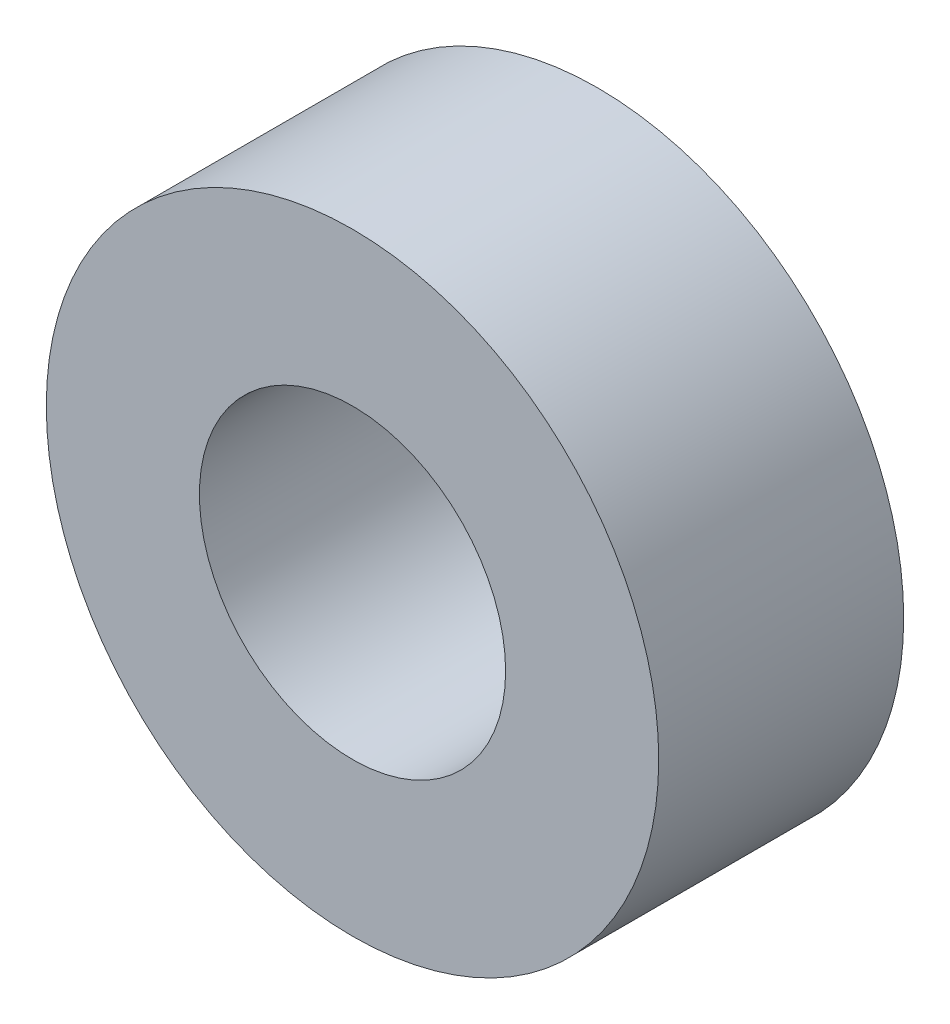
ISO-10303-21;
HEADER;
FILE_DESCRIPTION(('STEP AP214'),'2;1');
FILE_NAME('part.step','',(''),(''),'','','');
FILE_SCHEMA(('AUTOMOTIVE_DESIGN { 1 0 10303 214 1 1 1 1 }'));
ENDSEC;
DATA;
#1=APPLICATION_CONTEXT('core data for automotive mechanical design processes');
#2=APPLICATION_PROTOCOL_DEFINITION('international standard','automotive_design',2000,#1);
#3=PRODUCT_CONTEXT('',#1,'mechanical');
#4=PRODUCT('Part','Part','',(#3));
#5=PRODUCT_RELATED_PRODUCT_CATEGORY('part','',(#4));
#6=PRODUCT_DEFINITION_FORMATION('','',#4);
#7=PRODUCT_DEFINITION_CONTEXT('part definition',#1,'design');
#8=PRODUCT_DEFINITION('design','',#6,#7);
#9=PRODUCT_DEFINITION_SHAPE('','',#8);
#10=(LENGTH_UNIT() NAMED_UNIT(*) SI_UNIT(.MILLI.,.METRE.));
#11=(NAMED_UNIT(*) PLANE_ANGLE_UNIT() SI_UNIT($,.RADIAN.));
#12=(NAMED_UNIT(*) SI_UNIT($,.STERADIAN.) SOLID_ANGLE_UNIT());
#13=UNCERTAINTY_MEASURE_WITH_UNIT(LENGTH_MEASURE(1.E-05),#10,'distance_accuracy_value','');
#14=(GEOMETRIC_REPRESENTATION_CONTEXT(3) GLOBAL_UNCERTAINTY_ASSIGNED_CONTEXT((#13)) GLOBAL_UNIT_ASSIGNED_CONTEXT((#10,
#11,#12)) REPRESENTATION_CONTEXT('',''));
#15=CARTESIAN_POINT('',(0.,0.,0.));
#16=DIRECTION('',(0.,0.,1.));
#17=DIRECTION('',(1.,0.,0.));
#18=AXIS2_PLACEMENT_3D('',#15,#16,#17);
#19=CARTESIAN_POINT('',(0.,0.,2.));
#20=DIRECTION('',(0.,0.,1.));
#21=DIRECTION('',(1.,0.,0.));
#22=AXIS2_PLACEMENT_3D('',#19,#20,#21);
#23=PLANE('',#22);
#24=CARTESIAN_POINT('',(0.,0.,2.));
#25=DIRECTION('',(0.,0.,1.));
#26=DIRECTION('',(1.,0.,0.));
#27=AXIS2_PLACEMENT_3D('',#24,#25,#26);
#28=CIRCLE('',#27,2.5);
#29=CARTESIAN_POINT('',(2.5,0.,2.));
#30=VERTEX_POINT('',#29);
#31=EDGE_CURVE('E10',#30,#30,#28,.T.);
#32=ORIENTED_EDGE('',*,*,#31,.T.);
#33=EDGE_LOOP('',(#32));
#34=FACE_BOUND('',#33,.T.);
#35=CARTESIAN_POINT('',(0.,0.,2.));
#36=DIRECTION('',(0.,0.,1.));
#37=DIRECTION('',(1.,0.,0.));
#38=AXIS2_PLACEMENT_3D('',#35,#36,#37);
#39=CIRCLE('',#38,1.25);
#40=CARTESIAN_POINT('',(1.25,0.,2.));
#41=VERTEX_POINT('',#40);
#42=EDGE_CURVE('E43',#41,#41,#39,.T.);
#43=ORIENTED_EDGE('',*,*,#42,.F.);
#44=EDGE_LOOP('',(#43));
#45=FACE_BOUND('',#44,.T.);
#46=ADVANCED_FACE('F32',(#34,#45),#23,.T.);
#47=CARTESIAN_POINT('',(0.,0.,0.));
#48=DIRECTION('',(0.,0.,1.));
#49=DIRECTION('',(1.,0.,0.));
#50=AXIS2_PLACEMENT_3D('',#47,#48,#49);
#51=PLANE('',#50);
#52=CARTESIAN_POINT('',(0.,0.,0.));
#53=DIRECTION('',(0.,0.,1.));
#54=DIRECTION('',(1.,0.,0.));
#55=AXIS2_PLACEMENT_3D('',#52,#53,#54);
#56=CIRCLE('',#55,2.5);
#57=CARTESIAN_POINT('',(2.5,0.,0.));
#58=VERTEX_POINT('',#57);
#59=EDGE_CURVE('E36',#58,#58,#56,.T.);
#60=ORIENTED_EDGE('',*,*,#59,.F.);
#61=EDGE_LOOP('',(#60));
#62=FACE_BOUND('',#61,.T.);
#63=CARTESIAN_POINT('',(0.,0.,0.));
#64=DIRECTION('',(0.,0.,1.));
#65=DIRECTION('',(1.,0.,0.));
#66=AXIS2_PLACEMENT_3D('',#63,#64,#65);
#67=CIRCLE('',#66,1.25);
#68=CARTESIAN_POINT('',(1.25,0.,0.));
#69=VERTEX_POINT('',#68);
#70=EDGE_CURVE('E45',#69,#69,#67,.T.);
#71=ORIENTED_EDGE('',*,*,#70,.T.);
#72=EDGE_LOOP('',(#71));
#73=FACE_BOUND('',#72,.T.);
#74=ADVANCED_FACE('F55',(#62,#73),#51,.F.);
#75=CARTESIAN_POINT('',(0.,0.,2.));
#76=DIRECTION('',(0.,0.,-1.));
#77=DIRECTION('',(-1.,0.,0.));
#78=AXIS2_PLACEMENT_3D('',#75,#76,#77);
#79=CYLINDRICAL_SURFACE('',#78,2.5);
#80=ORIENTED_EDGE('',*,*,#31,.F.);
#81=EDGE_LOOP('',(#80));
#82=FACE_BOUND('',#81,.T.);
#83=ORIENTED_EDGE('',*,*,#59,.T.);
#84=EDGE_LOOP('',(#83));
#85=FACE_BOUND('',#84,.T.);
#86=ADVANCED_FACE('F34',(#82,#85),#79,.T.);
#87=CARTESIAN_POINT('',(0.,0.,2.));
#88=DIRECTION('',(0.,0.,-1.));
#89=DIRECTION('',(-1.,0.,0.));
#90=AXIS2_PLACEMENT_3D('',#87,#88,#89);
#91=CYLINDRICAL_SURFACE('',#90,1.25);
#92=ORIENTED_EDGE('',*,*,#42,.T.);
#93=EDGE_LOOP('',(#92));
#94=FACE_BOUND('',#93,.T.);
#95=ORIENTED_EDGE('',*,*,#70,.F.);
#96=EDGE_LOOP('',(#95));
#97=FACE_BOUND('',#96,.T.);
#98=ADVANCED_FACE('F51',(#94,#97),#91,.F.);
#99=CLOSED_SHELL('',(#46,#74,#86,#98));
#100=MANIFOLD_SOLID_BREP('B2',#99);
#101=ADVANCED_BREP_SHAPE_REPRESENTATION('',(#18,#100),#14);
#102=SHAPE_DEFINITION_REPRESENTATION(#9,#101);
ENDSEC;
END-ISO-10303-21;
